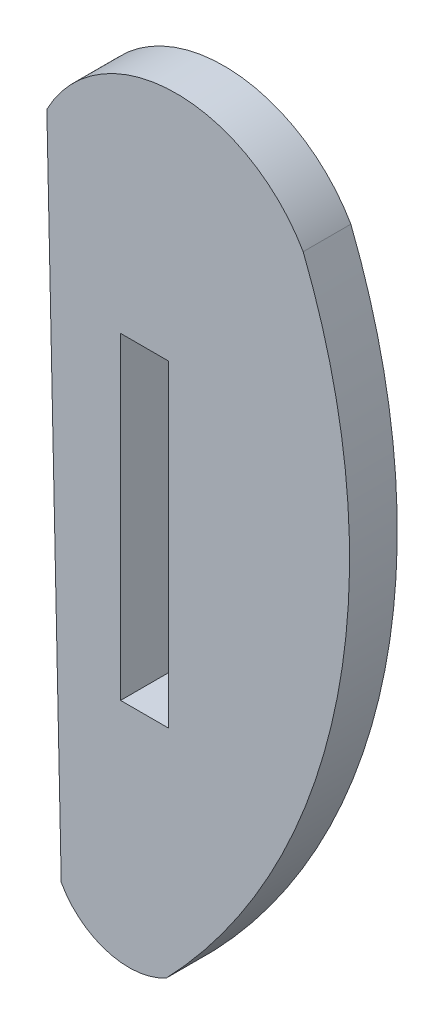
ISO-10303-21;
HEADER;
FILE_DESCRIPTION(('STEP AP214'),'2;1');
FILE_NAME('part.step','',(''),(''),'','','');
FILE_SCHEMA(('AUTOMOTIVE_DESIGN { 1 0 10303 214 1 1 1 1 }'));
ENDSEC;
DATA;
#1=APPLICATION_CONTEXT('core data for automotive mechanical design processes');
#2=APPLICATION_PROTOCOL_DEFINITION('international standard','automotive_design',2000,#1);
#3=PRODUCT_CONTEXT('',#1,'mechanical');
#4=PRODUCT('Part','Part','',(#3));
#5=PRODUCT_RELATED_PRODUCT_CATEGORY('part','',(#4));
#6=PRODUCT_DEFINITION_FORMATION('','',#4);
#7=PRODUCT_DEFINITION_CONTEXT('part definition',#1,'design');
#8=PRODUCT_DEFINITION('design','',#6,#7);
#9=PRODUCT_DEFINITION_SHAPE('','',#8);
#10=(LENGTH_UNIT() NAMED_UNIT(*) SI_UNIT(.MILLI.,.METRE.));
#11=(NAMED_UNIT(*) PLANE_ANGLE_UNIT() SI_UNIT($,.RADIAN.));
#12=(NAMED_UNIT(*) SI_UNIT($,.STERADIAN.) SOLID_ANGLE_UNIT());
#13=UNCERTAINTY_MEASURE_WITH_UNIT(LENGTH_MEASURE(1.E-05),#10,'distance_accuracy_value','');
#14=(GEOMETRIC_REPRESENTATION_CONTEXT(3) GLOBAL_UNCERTAINTY_ASSIGNED_CONTEXT((#13)) GLOBAL_UNIT_ASSIGNED_CONTEXT((#10,
#11,#12)) REPRESENTATION_CONTEXT('',''));
#15=CARTESIAN_POINT('',(0.,0.,0.));
#16=DIRECTION('',(0.,0.,1.));
#17=DIRECTION('',(1.,0.,0.));
#18=AXIS2_PLACEMENT_3D('',#15,#16,#17);
#19=CARTESIAN_POINT('',(-716.670597681384,-127.876737588668,3.00000000000013));
#20=DIRECTION('',(0.,0.,-1.));
#21=DIRECTION('',(-1.,0.,0.));
#22=AXIS2_PLACEMENT_3D('',#19,#20,#21);
#23=PLANE('',#22);
#24=CARTESIAN_POINT('',(-716.670597681384,-127.876737588668,3.00000000000013));
#25=DIRECTION('',(0.,0.,1.));
#26=DIRECTION('',(-1.,0.,0.));
#27=AXIS2_PLACEMENT_3D('',#24,#25,#26);
#28=CIRCLE('',#27,4.8673289791111);
#29=CARTESIAN_POINT('',(-720.928496367707,-130.234955171485,3.00000000000009));
#30=VERTEX_POINT('',#29);
#31=CARTESIAN_POINT('',(-714.312380098567,-132.13463627499,3.00000000000012));
#32=VERTEX_POINT('',#31);
#33=EDGE_CURVE('E141',#30,#32,#28,.T.);
#34=ORIENTED_EDGE('',*,*,#33,.T.);
#35=CARTESIAN_POINT('',(-744.094917199564,-103.511502965239,3.00000000000011));
#36=DIRECTION('',(0.,0.,1.));
#37=DIRECTION('',(-1.,0.,0.));
#38=AXIS2_PLACEMENT_3D('',#35,#36,#37);
#39=CIRCLE('',#38,41.3071819014569);
#40=CARTESIAN_POINT('',(-705.707617136892,-88.2570455662225,3.00000000000016));
#41=VERTEX_POINT('',#40);
#42=EDGE_CURVE('E144',#32,#41,#39,.T.);
#43=ORIENTED_EDGE('',*,*,#42,.T.);
#44=CARTESIAN_POINT('',(-713.687897589622,-92.8070520609565,3.00000000000014));
#45=DIRECTION('',(0.,0.,1.));
#46=DIRECTION('',(-1.,0.,0.));
#47=AXIS2_PLACEMENT_3D('',#44,#45,#46);
#48=CIRCLE('',#47,9.18626339739712);
#49=CARTESIAN_POINT('',(-721.834448627701,-88.5619205682541,3.00000000000013));
#50=VERTEX_POINT('',#49);
#51=EDGE_CURVE('E146',#41,#50,#48,.T.);
#52=ORIENTED_EDGE('',*,*,#51,.T.);
#53=DIRECTION('',(0.0217343964669345,-0.99976378010519,0.));
#54=VECTOR('',#53,1.);
#55=CARTESIAN_POINT('',(-720.928496367707,-130.234955171485,3.00000000000009));
#56=LINE('',#55,#54);
#57=EDGE_CURVE('E148',#50,#30,#56,.T.);
#58=ORIENTED_EDGE('',*,*,#57,.T.);
#59=EDGE_LOOP('',(#34,#43,#52,#58));
#60=FACE_BOUND('',#59,.T.);
#61=DIRECTION('',(0.,-1.,0.));
#62=VECTOR('',#61,1.);
#63=CARTESIAN_POINT('',(-717.195158937461,-98.4509493678063,3.00000000000011));
#64=LINE('',#63,#62);
#65=CARTESIAN_POINT('',(-717.195158937461,-98.4509493678063,3.00000000000011));
#66=VERTEX_POINT('',#65);
#67=CARTESIAN_POINT('',(-717.195158937461,-118.450949367806,3.00000000000018));
#68=VERTEX_POINT('',#67);
#69=EDGE_CURVE('E112',#66,#68,#64,.T.);
#70=ORIENTED_EDGE('',*,*,#69,.F.);
#71=DIRECTION('',(-1.,0.,0.));
#72=VECTOR('',#71,1.);
#73=CARTESIAN_POINT('',(-714.195158937461,-98.4509493678063,3.00000000000007));
#74=LINE('',#73,#72);
#75=CARTESIAN_POINT('',(-714.195158937461,-98.4509493678063,3.00000000000007));
#76=VERTEX_POINT('',#75);
#77=EDGE_CURVE('E127',#76,#66,#74,.T.);
#78=ORIENTED_EDGE('',*,*,#77,.F.);
#79=DIRECTION('',(0.,1.,0.));
#80=VECTOR('',#79,1.);
#81=CARTESIAN_POINT('',(-714.19515893746,-118.450949367806,3.00000000000013));
#82=LINE('',#81,#80);
#83=CARTESIAN_POINT('',(-714.19515893746,-118.450949367806,3.00000000000013));
#84=VERTEX_POINT('',#83);
#85=EDGE_CURVE('E125',#84,#76,#82,.T.);
#86=ORIENTED_EDGE('',*,*,#85,.F.);
#87=DIRECTION('',(1.,0.,0.));
#88=VECTOR('',#87,1.);
#89=CARTESIAN_POINT('',(-717.195158937461,-118.450949367806,3.00000000000018));
#90=LINE('',#89,#88);
#91=EDGE_CURVE('E123',#68,#84,#90,.T.);
#92=ORIENTED_EDGE('',*,*,#91,.F.);
#93=EDGE_LOOP('',(#70,#78,#86,#92));
#94=FACE_BOUND('',#93,.T.);
#95=ADVANCED_FACE('F32',(#60,#94),#23,.F.);
#96=CARTESIAN_POINT('',(-716.670597681384,-127.876737588668,1.31838984174237E-13));
#97=DIRECTION('',(0.,0.,-1.));
#98=DIRECTION('',(-1.,0.,0.));
#99=AXIS2_PLACEMENT_3D('',#96,#97,#98);
#100=PLANE('',#99);
#101=CARTESIAN_POINT('',(-716.670597681384,-127.876737588668,1.31838984174237E-13));
#102=DIRECTION('',(0.,0.,1.));
#103=DIRECTION('',(-1.,0.,0.));
#104=AXIS2_PLACEMENT_3D('',#101,#102,#103);
#105=CIRCLE('',#104,4.8673289791111);
#106=CARTESIAN_POINT('',(-720.928496367707,-130.234955171485,0.));
#107=VERTEX_POINT('',#106);
#108=CARTESIAN_POINT('',(-714.312380098567,-132.13463627499,1.45716771982052E-13));
#109=VERTEX_POINT('',#108);
#110=EDGE_CURVE('E113',#107,#109,#105,.T.);
#111=ORIENTED_EDGE('',*,*,#110,.F.);
#112=DIRECTION('',(0.0217343964669345,-0.99976378010519,0.));
#113=VECTOR('',#112,1.);
#114=CARTESIAN_POINT('',(-720.928496367707,-130.234955171485,0.));
#115=LINE('',#114,#113);
#116=CARTESIAN_POINT('',(-721.834448627701,-88.5619205682541,1.38777878078145E-13));
#117=VERTEX_POINT('',#116);
#118=EDGE_CURVE('E139',#117,#107,#115,.T.);
#119=ORIENTED_EDGE('',*,*,#118,.F.);
#120=CARTESIAN_POINT('',(-713.687897589622,-92.8070520609565,1.04083408558608E-13));
#121=DIRECTION('',(0.,0.,1.));
#122=DIRECTION('',(-1.,0.,0.));
#123=AXIS2_PLACEMENT_3D('',#120,#121,#122);
#124=CIRCLE('',#123,9.18626339739712);
#125=CARTESIAN_POINT('',(-705.707617136892,-88.2570455662224,0.));
#126=VERTEX_POINT('',#125);
#127=EDGE_CURVE('E137',#126,#117,#124,.T.);
#128=ORIENTED_EDGE('',*,*,#127,.F.);
#129=CARTESIAN_POINT('',(-744.094917199564,-103.511502965239,1.04083408558608E-13));
#130=DIRECTION('',(0.,0.,1.));
#131=DIRECTION('',(-1.,0.,0.));
#132=AXIS2_PLACEMENT_3D('',#129,#130,#131);
#133=CIRCLE('',#132,41.3071819014569);
#134=EDGE_CURVE('E135',#109,#126,#133,.T.);
#135=ORIENTED_EDGE('',*,*,#134,.F.);
#136=EDGE_LOOP('',(#111,#119,#128,#135));
#137=FACE_BOUND('',#136,.T.);
#138=DIRECTION('',(-1.,0.,0.));
#139=VECTOR('',#138,1.);
#140=CARTESIAN_POINT('',(-714.195158937461,-98.4509493678063,1.11022302462516E-13));
#141=LINE('',#140,#139);
#142=CARTESIAN_POINT('',(-714.195158937461,-98.4509493678063,1.11022302462516E-13));
#143=VERTEX_POINT('',#142);
#144=CARTESIAN_POINT('',(-717.195158937461,-98.4509493678063,1.38777878078145E-13));
#145=VERTEX_POINT('',#144);
#146=EDGE_CURVE('E117',#143,#145,#141,.T.);
#147=ORIENTED_EDGE('',*,*,#146,.T.);
#148=DIRECTION('',(0.,-1.,0.));
#149=VECTOR('',#148,1.);
#150=CARTESIAN_POINT('',(-717.195158937461,-98.4509493678063,1.38777878078145E-13));
#151=LINE('',#150,#149);
#152=CARTESIAN_POINT('',(-717.195158937461,-118.450949367806,1.87350135405495E-13));
#153=VERTEX_POINT('',#152);
#154=EDGE_CURVE('E55',#145,#153,#151,.T.);
#155=ORIENTED_EDGE('',*,*,#154,.T.);
#156=DIRECTION('',(1.,0.,0.));
#157=VECTOR('',#156,1.);
#158=CARTESIAN_POINT('',(-717.195158937461,-118.450949367806,1.87350135405495E-13));
#159=LINE('',#158,#157);
#160=CARTESIAN_POINT('',(-714.195158937461,-118.450949367806,1.11022302462516E-13));
#161=VERTEX_POINT('',#160);
#162=EDGE_CURVE('E99',#153,#161,#159,.T.);
#163=ORIENTED_EDGE('',*,*,#162,.T.);
#164=DIRECTION('',(0.,1.,0.));
#165=VECTOR('',#164,1.);
#166=CARTESIAN_POINT('',(-714.195158937461,-118.450949367806,1.11022302462516E-13));
#167=LINE('',#166,#165);
#168=EDGE_CURVE('E108',#161,#143,#167,.T.);
#169=ORIENTED_EDGE('',*,*,#168,.T.);
#170=EDGE_LOOP('',(#147,#155,#163,#169));
#171=FACE_BOUND('',#170,.T.);
#172=ADVANCED_FACE('F116',(#137,#171),#100,.T.);
#173=CARTESIAN_POINT('',(-716.670597681384,-127.876737588668,3.00000000000013));
#174=DIRECTION('',(0.,0.,-1.));
#175=DIRECTION('',(-1.,0.,0.));
#176=AXIS2_PLACEMENT_3D('',#173,#174,#175);
#177=CYLINDRICAL_SURFACE('',#176,4.8673289791111);
#178=ORIENTED_EDGE('',*,*,#110,.T.);
#179=DIRECTION('',(0.,0.,-1.));
#180=VECTOR('',#179,1.);
#181=CARTESIAN_POINT('',(-714.312380098567,-132.13463627499,3.00000000000012));
#182=LINE('',#181,#180);
#183=EDGE_CURVE('E11',#32,#109,#182,.T.);
#184=ORIENTED_EDGE('',*,*,#183,.F.);
#185=ORIENTED_EDGE('',*,*,#33,.F.);
#186=DIRECTION('',(0.,0.,-1.));
#187=VECTOR('',#186,1.);
#188=CARTESIAN_POINT('',(-720.928496367707,-130.234955171485,3.00000000000009));
#189=LINE('',#188,#187);
#190=EDGE_CURVE('E150',#30,#107,#189,.T.);
#191=ORIENTED_EDGE('',*,*,#190,.T.);
#192=EDGE_LOOP('',(#178,#184,#185,#191));
#193=FACE_BOUND('',#192,.T.);
#194=ADVANCED_FACE('F34',(#193),#177,.T.);
#195=CARTESIAN_POINT('',(-744.094917199564,-103.511502965239,3.00000000000011));
#196=DIRECTION('',(0.,0.,-1.));
#197=DIRECTION('',(-1.,0.,0.));
#198=AXIS2_PLACEMENT_3D('',#195,#196,#197);
#199=CYLINDRICAL_SURFACE('',#198,41.3071819014569);
#200=ORIENTED_EDGE('',*,*,#134,.T.);
#201=DIRECTION('',(0.,0.,-1.));
#202=VECTOR('',#201,1.);
#203=CARTESIAN_POINT('',(-705.707617136892,-88.2570455662225,3.00000000000016));
#204=LINE('',#203,#202);
#205=EDGE_CURVE('E40',#41,#126,#204,.T.);
#206=ORIENTED_EDGE('',*,*,#205,.F.);
#207=ORIENTED_EDGE('',*,*,#42,.F.);
#208=ORIENTED_EDGE('',*,*,#183,.T.);
#209=EDGE_LOOP('',(#200,#206,#207,#208));
#210=FACE_BOUND('',#209,.T.);
#211=ADVANCED_FACE('F175',(#210),#199,.T.);
#212=CARTESIAN_POINT('',(-713.687897589622,-92.8070520609565,3.00000000000014));
#213=DIRECTION('',(0.,0.,-1.));
#214=DIRECTION('',(-1.,0.,0.));
#215=AXIS2_PLACEMENT_3D('',#212,#213,#214);
#216=CYLINDRICAL_SURFACE('',#215,9.18626339739712);
#217=ORIENTED_EDGE('',*,*,#127,.T.);
#218=DIRECTION('',(0.,0.,-1.));
#219=VECTOR('',#218,1.);
#220=CARTESIAN_POINT('',(-721.834448627701,-88.5619205682541,3.00000000000013));
#221=LINE('',#220,#219);
#222=EDGE_CURVE('E153',#50,#117,#221,.T.);
#223=ORIENTED_EDGE('',*,*,#222,.F.);
#224=ORIENTED_EDGE('',*,*,#51,.F.);
#225=ORIENTED_EDGE('',*,*,#205,.T.);
#226=EDGE_LOOP('',(#217,#223,#224,#225));
#227=FACE_BOUND('',#226,.T.);
#228=ADVANCED_FACE('F160',(#227),#216,.T.);
#229=CARTESIAN_POINT('',(-720.928496367707,-130.234955171485,3.00000000000009));
#230=DIRECTION('',(0.99976378010519,0.0217343964669343,0.));
#231=DIRECTION('',(-0.0217343964669345,0.99976378010519,0.));
#232=AXIS2_PLACEMENT_3D('',#229,#230,#231);
#233=PLANE('',#232);
#234=ORIENTED_EDGE('',*,*,#118,.T.);
#235=ORIENTED_EDGE('',*,*,#190,.F.);
#236=ORIENTED_EDGE('',*,*,#57,.F.);
#237=ORIENTED_EDGE('',*,*,#222,.T.);
#238=EDGE_LOOP('',(#234,#235,#236,#237));
#239=FACE_BOUND('',#238,.T.);
#240=ADVANCED_FACE('F168',(#239),#233,.F.);
#241=CARTESIAN_POINT('',(-717.195158937461,-98.4509493678063,3.00000000000011));
#242=DIRECTION('',(1.,0.,0.));
#243=DIRECTION('',(0.,0.,-1.));
#244=AXIS2_PLACEMENT_3D('',#241,#242,#243);
#245=PLANE('',#244);
#246=ORIENTED_EDGE('',*,*,#154,.F.);
#247=DIRECTION('',(0.,0.,-1.));
#248=VECTOR('',#247,1.);
#249=CARTESIAN_POINT('',(-717.195158937461,-98.4509493678063,3.00000000000011));
#250=LINE('',#249,#248);
#251=EDGE_CURVE('E129',#66,#145,#250,.T.);
#252=ORIENTED_EDGE('',*,*,#251,.F.);
#253=ORIENTED_EDGE('',*,*,#69,.T.);
#254=DIRECTION('',(0.,0.,-1.));
#255=VECTOR('',#254,1.);
#256=CARTESIAN_POINT('',(-717.195158937461,-118.450949367806,3.00000000000018));
#257=LINE('',#256,#255);
#258=EDGE_CURVE('E101',#68,#153,#257,.T.);
#259=ORIENTED_EDGE('',*,*,#258,.T.);
#260=EDGE_LOOP('',(#246,#252,#253,#259));
#261=FACE_BOUND('',#260,.T.);
#262=ADVANCED_FACE('F110',(#261),#245,.T.);
#263=CARTESIAN_POINT('',(-717.195158937461,-118.450949367806,3.00000000000018));
#264=DIRECTION('',(0.,1.,0.));
#265=DIRECTION('',(0.,0.,1.));
#266=AXIS2_PLACEMENT_3D('',#263,#264,#265);
#267=PLANE('',#266);
#268=ORIENTED_EDGE('',*,*,#162,.F.);
#269=ORIENTED_EDGE('',*,*,#258,.F.);
#270=ORIENTED_EDGE('',*,*,#91,.T.);
#271=DIRECTION('',(0.,0.,-1.));
#272=VECTOR('',#271,1.);
#273=CARTESIAN_POINT('',(-714.19515893746,-118.450949367806,3.00000000000013));
#274=LINE('',#273,#272);
#275=EDGE_CURVE('E104',#84,#161,#274,.T.);
#276=ORIENTED_EDGE('',*,*,#275,.T.);
#277=EDGE_LOOP('',(#268,#269,#270,#276));
#278=FACE_BOUND('',#277,.T.);
#279=ADVANCED_FACE('F100',(#278),#267,.T.);
#280=CARTESIAN_POINT('',(-714.19515893746,-118.450949367806,3.00000000000013));
#281=DIRECTION('',(-1.,0.,0.));
#282=DIRECTION('',(0.,0.,1.));
#283=AXIS2_PLACEMENT_3D('',#280,#281,#282);
#284=PLANE('',#283);
#285=ORIENTED_EDGE('',*,*,#168,.F.);
#286=ORIENTED_EDGE('',*,*,#275,.F.);
#287=ORIENTED_EDGE('',*,*,#85,.T.);
#288=DIRECTION('',(0.,0.,-1.));
#289=VECTOR('',#288,1.);
#290=CARTESIAN_POINT('',(-714.195158937461,-98.4509493678063,3.00000000000007));
#291=LINE('',#290,#289);
#292=EDGE_CURVE('E47',#76,#143,#291,.T.);
#293=ORIENTED_EDGE('',*,*,#292,.T.);
#294=EDGE_LOOP('',(#285,#286,#287,#293));
#295=FACE_BOUND('',#294,.T.);
#296=ADVANCED_FACE('F197',(#295),#284,.T.);
#297=CARTESIAN_POINT('',(-714.195158937461,-98.4509493678063,3.00000000000007));
#298=DIRECTION('',(0.,-1.,0.));
#299=DIRECTION('',(0.,0.,-1.));
#300=AXIS2_PLACEMENT_3D('',#297,#298,#299);
#301=PLANE('',#300);
#302=ORIENTED_EDGE('',*,*,#146,.F.);
#303=ORIENTED_EDGE('',*,*,#292,.F.);
#304=ORIENTED_EDGE('',*,*,#77,.T.);
#305=ORIENTED_EDGE('',*,*,#251,.T.);
#306=EDGE_LOOP('',(#302,#303,#304,#305));
#307=FACE_BOUND('',#306,.T.);
#308=ADVANCED_FACE('F202',(#307),#301,.T.);
#309=CLOSED_SHELL('',(#95,#172,#194,#211,#228,#240,#262,#279,#296,#308));
#310=MANIFOLD_SOLID_BREP('B2',#309);
#311=ADVANCED_BREP_SHAPE_REPRESENTATION('',(#18,#310),#14);
#312=SHAPE_DEFINITION_REPRESENTATION(#9,#311);
ENDSEC;
END-ISO-10303-21;
